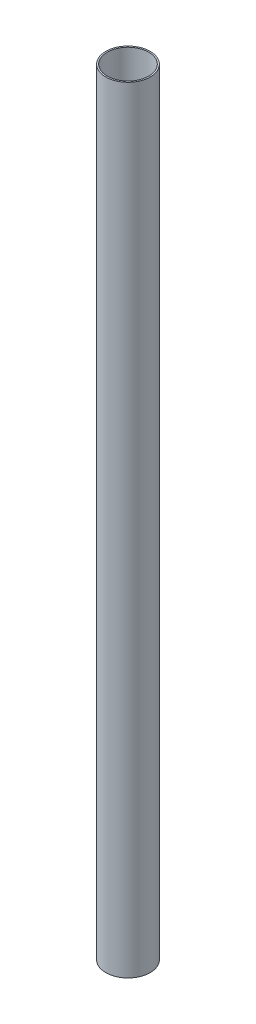
ISO-10303-21;
HEADER;
FILE_DESCRIPTION(('STEP AP214'),'2;1');
FILE_NAME('part.step','',(''),(''),'','','');
FILE_SCHEMA(('AUTOMOTIVE_DESIGN { 1 0 10303 214 1 1 1 1 }'));
ENDSEC;
DATA;
#1=APPLICATION_CONTEXT('core data for automotive mechanical design processes');
#2=APPLICATION_PROTOCOL_DEFINITION('international standard','automotive_design',2000,#1);
#3=PRODUCT_CONTEXT('',#1,'mechanical');
#4=PRODUCT('Part','Part','',(#3));
#5=PRODUCT_RELATED_PRODUCT_CATEGORY('part','',(#4));
#6=PRODUCT_DEFINITION_FORMATION('','',#4);
#7=PRODUCT_DEFINITION_CONTEXT('part definition',#1,'design');
#8=PRODUCT_DEFINITION('design','',#6,#7);
#9=PRODUCT_DEFINITION_SHAPE('','',#8);
#10=(LENGTH_UNIT() NAMED_UNIT(*) SI_UNIT(.MILLI.,.METRE.));
#11=(NAMED_UNIT(*) PLANE_ANGLE_UNIT() SI_UNIT($,.RADIAN.));
#12=(NAMED_UNIT(*) SI_UNIT($,.STERADIAN.) SOLID_ANGLE_UNIT());
#13=UNCERTAINTY_MEASURE_WITH_UNIT(LENGTH_MEASURE(1.E-05),#10,'distance_accuracy_value','');
#14=(GEOMETRIC_REPRESENTATION_CONTEXT(3) GLOBAL_UNCERTAINTY_ASSIGNED_CONTEXT((#13)) GLOBAL_UNIT_ASSIGNED_CONTEXT((#10,
#11,#12)) REPRESENTATION_CONTEXT('',''));
#15=CARTESIAN_POINT('',(0.,0.,0.));
#16=DIRECTION('',(0.,0.,1.));
#17=DIRECTION('',(1.,0.,0.));
#18=AXIS2_PLACEMENT_3D('',#15,#16,#17);
#19=CARTESIAN_POINT('',(0.,785.,0.));
#20=DIRECTION('',(0.,1.,0.));
#21=DIRECTION('',(0.,0.,1.));
#22=AXIS2_PLACEMENT_3D('',#19,#20,#21);
#23=PLANE('',#22);
#24=CARTESIAN_POINT('',(0.,785.,0.));
#25=DIRECTION('',(0.,1.,0.));
#26=DIRECTION('',(0.,0.,1.));
#27=AXIS2_PLACEMENT_3D('',#24,#25,#26);
#28=CIRCLE('',#27,22.5);
#29=CARTESIAN_POINT('',(0.,785.,22.5));
#30=VERTEX_POINT('',#29);
#31=EDGE_CURVE('E102',#30,#30,#28,.T.);
#32=ORIENTED_EDGE('',*,*,#31,.T.);
#33=EDGE_LOOP('',(#32));
#34=FACE_BOUND('',#33,.T.);
#35=CARTESIAN_POINT('',(0.,785.,0.));
#36=DIRECTION('',(0.,1.,0.));
#37=DIRECTION('',(0.,0.,1.));
#38=AXIS2_PLACEMENT_3D('',#35,#36,#37);
#39=CIRCLE('',#38,21.);
#40=CARTESIAN_POINT('',(0.,785.,21.));
#41=VERTEX_POINT('',#40);
#42=EDGE_CURVE('E94',#41,#41,#39,.T.);
#43=ORIENTED_EDGE('',*,*,#42,.F.);
#44=EDGE_LOOP('',(#43));
#45=FACE_BOUND('',#44,.T.);
#46=ADVANCED_FACE('F35',(#34,#45),#23,.T.);
#47=CARTESIAN_POINT('',(0.,0.,0.));
#48=DIRECTION('',(0.,1.,0.));
#49=DIRECTION('',(0.,0.,1.));
#50=AXIS2_PLACEMENT_3D('',#47,#48,#49);
#51=PLANE('',#50);
#52=CARTESIAN_POINT('',(0.,0.,0.));
#53=DIRECTION('',(0.,1.,0.));
#54=DIRECTION('',(0.,0.,1.));
#55=AXIS2_PLACEMENT_3D('',#52,#53,#54);
#56=CIRCLE('',#55,22.5);
#57=CARTESIAN_POINT('',(0.,0.,22.5));
#58=VERTEX_POINT('',#57);
#59=EDGE_CURVE('E100',#58,#58,#56,.T.);
#60=ORIENTED_EDGE('',*,*,#59,.F.);
#61=EDGE_LOOP('',(#60));
#62=FACE_BOUND('',#61,.T.);
#63=CARTESIAN_POINT('',(0.,0.,0.));
#64=DIRECTION('',(0.,1.,0.));
#65=DIRECTION('',(0.,0.,1.));
#66=AXIS2_PLACEMENT_3D('',#63,#64,#65);
#67=CIRCLE('',#66,21.);
#68=CARTESIAN_POINT('',(0.,0.,21.));
#69=VERTEX_POINT('',#68);
#70=EDGE_CURVE('E91',#69,#69,#67,.T.);
#71=ORIENTED_EDGE('',*,*,#70,.T.);
#72=EDGE_LOOP('',(#71));
#73=FACE_BOUND('',#72,.T.);
#74=ADVANCED_FACE('F134',(#62,#73),#51,.F.);
#75=CARTESIAN_POINT('',(0.,785.,0.));
#76=DIRECTION('',(0.,-1.,0.));
#77=DIRECTION('',(0.,0.,-1.));
#78=AXIS2_PLACEMENT_3D('',#75,#76,#77);
#79=CYLINDRICAL_SURFACE('',#78,22.5);
#80=CARTESIAN_POINT('',(0.,160.,0.));
#81=DIRECTION('',(0.,-1.,0.));
#82=DIRECTION('',(0.,0.,-1.));
#83=AXIS2_PLACEMENT_3D('',#80,#81,#82);
#84=CIRCLE('',#83,22.5);
#85=CARTESIAN_POINT('',(-5.00000000000003,160.,-21.9374109684803));
#86=VERTEX_POINT('',#85);
#87=CARTESIAN_POINT('',(4.99999999999997,160.,-21.9374109684803));
#88=VERTEX_POINT('',#87);
#89=EDGE_CURVE('E90',#86,#88,#84,.T.);
#90=ORIENTED_EDGE('',*,*,#89,.T.);
#91=DIRECTION('',(0.,-1.,0.));
#92=VECTOR('',#91,1.);
#93=CARTESIAN_POINT('',(5.00000000000029,785.,-21.9374109684802));
#94=LINE('',#93,#92);
#95=CARTESIAN_POINT('',(5.,220.,-21.9374109684803));
#96=VERTEX_POINT('',#95);
#97=EDGE_CURVE('E83',#88,#96,#94,.F.);
#98=ORIENTED_EDGE('',*,*,#97,.T.);
#99=CARTESIAN_POINT('',(0.,220.,0.));
#100=DIRECTION('',(0.,1.,0.));
#101=DIRECTION('',(0.,0.,1.));
#102=AXIS2_PLACEMENT_3D('',#99,#100,#101);
#103=CIRCLE('',#102,22.5);
#104=CARTESIAN_POINT('',(-5.,220.,-21.9374109684803));
#105=VERTEX_POINT('',#104);
#106=EDGE_CURVE('E72',#96,#105,#103,.T.);
#107=ORIENTED_EDGE('',*,*,#106,.T.);
#108=DIRECTION('',(0.,-1.,0.));
#109=VECTOR('',#108,1.);
#110=CARTESIAN_POINT('',(-4.99999999999971,785.,-21.9374109684804));
#111=LINE('',#110,#109);
#112=EDGE_CURVE('E77',#105,#86,#111,.T.);
#113=ORIENTED_EDGE('',*,*,#112,.T.);
#114=EDGE_LOOP('',(#90,#98,#107,#113));
#115=FACE_BOUND('',#114,.T.);
#116=ORIENTED_EDGE('',*,*,#31,.F.);
#117=EDGE_LOOP('',(#116));
#118=FACE_BOUND('',#117,.T.);
#119=ORIENTED_EDGE('',*,*,#59,.T.);
#120=EDGE_LOOP('',(#119));
#121=FACE_BOUND('',#120,.T.);
#122=ADVANCED_FACE('F37',(#115,#118,#121),#79,.T.);
#123=CARTESIAN_POINT('',(0.,785.,0.));
#124=DIRECTION('',(0.,-1.,0.));
#125=DIRECTION('',(0.,0.,-1.));
#126=AXIS2_PLACEMENT_3D('',#123,#124,#125);
#127=CYLINDRICAL_SURFACE('',#126,21.);
#128=DIRECTION('',(0.,-1.,0.));
#129=VECTOR('',#128,1.);
#130=CARTESIAN_POINT('',(5.00000000000029,785.,-20.3960780543711));
#131=LINE('',#130,#129);
#132=CARTESIAN_POINT('',(4.99999999999997,160.,-20.3960780543711));
#133=VERTEX_POINT('',#132);
#134=CARTESIAN_POINT('',(5.,220.,-20.3960780543711));
#135=VERTEX_POINT('',#134);
#136=EDGE_CURVE('E11',#133,#135,#131,.F.);
#137=ORIENTED_EDGE('',*,*,#136,.F.);
#138=CARTESIAN_POINT('',(0.,160.,0.));
#139=DIRECTION('',(0.,-1.,0.));
#140=DIRECTION('',(0.,0.,-1.));
#141=AXIS2_PLACEMENT_3D('',#138,#139,#140);
#142=CIRCLE('',#141,21.);
#143=CARTESIAN_POINT('',(-5.00000000000003,160.,-20.3960780543712));
#144=VERTEX_POINT('',#143);
#145=EDGE_CURVE('E43',#144,#133,#142,.T.);
#146=ORIENTED_EDGE('',*,*,#145,.F.);
#147=DIRECTION('',(0.,-1.,0.));
#148=VECTOR('',#147,1.);
#149=CARTESIAN_POINT('',(-4.99999999999971,785.,-20.3960780543712));
#150=LINE('',#149,#148);
#151=CARTESIAN_POINT('',(-5.,220.,-20.3960780543711));
#152=VERTEX_POINT('',#151);
#153=EDGE_CURVE('E109',#152,#144,#150,.T.);
#154=ORIENTED_EDGE('',*,*,#153,.F.);
#155=CARTESIAN_POINT('',(0.,220.,0.));
#156=DIRECTION('',(0.,1.,0.));
#157=DIRECTION('',(0.,0.,1.));
#158=AXIS2_PLACEMENT_3D('',#155,#156,#157);
#159=CIRCLE('',#158,21.);
#160=EDGE_CURVE('E105',#135,#152,#159,.T.);
#161=ORIENTED_EDGE('',*,*,#160,.F.);
#162=EDGE_LOOP('',(#137,#146,#154,#161));
#163=FACE_BOUND('',#162,.T.);
#164=ORIENTED_EDGE('',*,*,#42,.T.);
#165=EDGE_LOOP('',(#164));
#166=FACE_BOUND('',#165,.T.);
#167=ORIENTED_EDGE('',*,*,#70,.F.);
#168=EDGE_LOOP('',(#167));
#169=FACE_BOUND('',#168,.T.);
#170=ADVANCED_FACE('F119',(#163,#166,#169),#127,.F.);
#171=CARTESIAN_POINT('',(4.99999999999997,160.,-785.));
#172=DIRECTION('',(1.,0.,0.));
#173=DIRECTION('',(0.,1.,0.));
#174=AXIS2_PLACEMENT_3D('',#171,#172,#173);
#175=PLANE('',#174);
#176=DIRECTION('',(0.,0.,1.));
#177=VECTOR('',#176,1.);
#178=CARTESIAN_POINT('',(4.99999999999997,160.,-785.));
#179=LINE('',#178,#177);
#180=EDGE_CURVE('E78',#88,#133,#179,.T.);
#181=ORIENTED_EDGE('',*,*,#180,.T.);
#182=ORIENTED_EDGE('',*,*,#136,.T.);
#183=DIRECTION('',(0.,0.,1.));
#184=VECTOR('',#183,1.);
#185=CARTESIAN_POINT('',(5.,220.,-785.));
#186=LINE('',#185,#184);
#187=EDGE_CURVE('E55',#96,#135,#186,.T.);
#188=ORIENTED_EDGE('',*,*,#187,.F.);
#189=ORIENTED_EDGE('',*,*,#97,.F.);
#190=EDGE_LOOP('',(#181,#182,#188,#189));
#191=FACE_BOUND('',#190,.T.);
#192=ADVANCED_FACE('F82',(#191),#175,.F.);
#193=CARTESIAN_POINT('',(4.99999999999997,160.,-785.));
#194=DIRECTION('',(0.,-1.,0.));
#195=DIRECTION('',(0.,0.,-1.));
#196=AXIS2_PLACEMENT_3D('',#193,#194,#195);
#197=PLANE('',#196);
#198=DIRECTION('',(0.,0.,1.));
#199=VECTOR('',#198,1.);
#200=CARTESIAN_POINT('',(-5.00000000000003,160.,-785.));
#201=LINE('',#200,#199);
#202=EDGE_CURVE('E115',#86,#144,#201,.T.);
#203=ORIENTED_EDGE('',*,*,#202,.T.);
#204=ORIENTED_EDGE('',*,*,#145,.T.);
#205=ORIENTED_EDGE('',*,*,#180,.F.);
#206=ORIENTED_EDGE('',*,*,#89,.F.);
#207=EDGE_LOOP('',(#203,#204,#205,#206));
#208=FACE_BOUND('',#207,.T.);
#209=ADVANCED_FACE('F113',(#208),#197,.F.);
#210=CARTESIAN_POINT('',(-5.00000000000003,160.,-785.));
#211=DIRECTION('',(-1.,0.,0.));
#212=DIRECTION('',(0.,-1.,0.));
#213=AXIS2_PLACEMENT_3D('',#210,#211,#212);
#214=PLANE('',#213);
#215=DIRECTION('',(0.,0.,1.));
#216=VECTOR('',#215,1.);
#217=CARTESIAN_POINT('',(-5.,220.,-785.));
#218=LINE('',#217,#216);
#219=EDGE_CURVE('E50',#105,#152,#218,.T.);
#220=ORIENTED_EDGE('',*,*,#219,.T.);
#221=ORIENTED_EDGE('',*,*,#153,.T.);
#222=ORIENTED_EDGE('',*,*,#202,.F.);
#223=ORIENTED_EDGE('',*,*,#112,.F.);
#224=EDGE_LOOP('',(#220,#221,#222,#223));
#225=FACE_BOUND('',#224,.T.);
#226=ADVANCED_FACE('F122',(#225),#214,.F.);
#227=CARTESIAN_POINT('',(5.,220.,-785.));
#228=DIRECTION('',(0.,1.,0.));
#229=DIRECTION('',(0.,0.,1.));
#230=AXIS2_PLACEMENT_3D('',#227,#228,#229);
#231=PLANE('',#230);
#232=ORIENTED_EDGE('',*,*,#187,.T.);
#233=ORIENTED_EDGE('',*,*,#160,.T.);
#234=ORIENTED_EDGE('',*,*,#219,.F.);
#235=ORIENTED_EDGE('',*,*,#106,.F.);
#236=EDGE_LOOP('',(#232,#233,#234,#235));
#237=FACE_BOUND('',#236,.T.);
#238=ADVANCED_FACE('F73',(#237),#231,.F.);
#239=CLOSED_SHELL('',(#46,#74,#122,#170,#192,#209,#226,#238));
#240=MANIFOLD_SOLID_BREP('B2',#239);
#241=ADVANCED_BREP_SHAPE_REPRESENTATION('',(#18,#240),#14);
#242=SHAPE_DEFINITION_REPRESENTATION(#9,#241);
ENDSEC;
END-ISO-10303-21;
